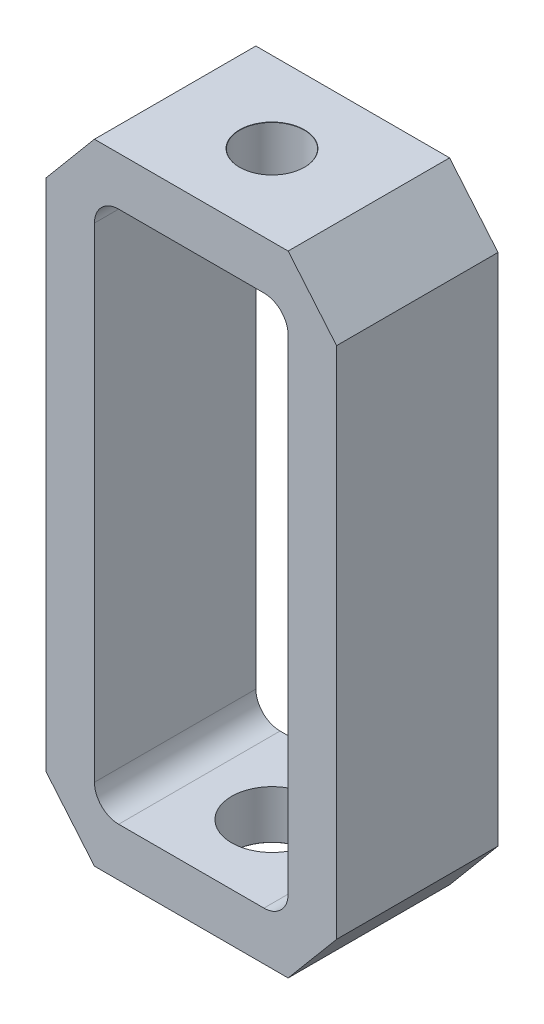
ISO-10303-21;
HEADER;
FILE_DESCRIPTION(('STEP AP214'),'2;1');
FILE_NAME('part.step','',(''),(''),'','','');
FILE_SCHEMA(('AUTOMOTIVE_DESIGN { 1 0 10303 214 1 1 1 1 }'));
ENDSEC;
DATA;
#1=APPLICATION_CONTEXT('core data for automotive mechanical design processes');
#2=APPLICATION_PROTOCOL_DEFINITION('international standard','automotive_design',2000,#1);
#3=PRODUCT_CONTEXT('',#1,'mechanical');
#4=PRODUCT('Part','Part','',(#3));
#5=PRODUCT_RELATED_PRODUCT_CATEGORY('part','',(#4));
#6=PRODUCT_DEFINITION_FORMATION('','',#4);
#7=PRODUCT_DEFINITION_CONTEXT('part definition',#1,'design');
#8=PRODUCT_DEFINITION('design','',#6,#7);
#9=PRODUCT_DEFINITION_SHAPE('','',#8);
#10=(LENGTH_UNIT() NAMED_UNIT(*) SI_UNIT(.MILLI.,.METRE.));
#11=(NAMED_UNIT(*) PLANE_ANGLE_UNIT() SI_UNIT($,.RADIAN.));
#12=(NAMED_UNIT(*) SI_UNIT($,.STERADIAN.) SOLID_ANGLE_UNIT());
#13=UNCERTAINTY_MEASURE_WITH_UNIT(LENGTH_MEASURE(1.E-05),#10,'distance_accuracy_value','');
#14=(GEOMETRIC_REPRESENTATION_CONTEXT(3) GLOBAL_UNCERTAINTY_ASSIGNED_CONTEXT((#13)) GLOBAL_UNIT_ASSIGNED_CONTEXT((#10,
#11,#12)) REPRESENTATION_CONTEXT('',''));
#15=CARTESIAN_POINT('',(0.,0.,0.));
#16=DIRECTION('',(0.,0.,1.));
#17=DIRECTION('',(1.,0.,0.));
#18=AXIS2_PLACEMENT_3D('',#15,#16,#17);
#19=CARTESIAN_POINT('',(-18.,0.,10.));
#20=DIRECTION('',(-1.,0.,0.));
#21=DIRECTION('',(0.,-1.,0.));
#22=AXIS2_PLACEMENT_3D('',#19,#20,#21);
#23=PLANE('',#22);
#24=DIRECTION('',(0.,1.,0.));
#25=VECTOR('',#24,1.);
#26=CARTESIAN_POINT('',(-18.,0.,-10.));
#27=LINE('',#26,#25);
#28=CARTESIAN_POINT('',(-18.,-31.8494784444347,-10.));
#29=VERTEX_POINT('',#28);
#30=CARTESIAN_POINT('',(-18.,31.8494784444347,-10.));
#31=VERTEX_POINT('',#30);
#32=EDGE_CURVE('E161',#29,#31,#27,.T.);
#33=ORIENTED_EDGE('',*,*,#32,.F.);
#34=DIRECTION('',(0.,0.,-1.));
#35=VECTOR('',#34,1.);
#36=CARTESIAN_POINT('',(-18.,-31.8494784444347,10.));
#37=LINE('',#36,#35);
#38=CARTESIAN_POINT('',(-18.,-31.8494784444347,10.));
#39=VERTEX_POINT('',#38);
#40=EDGE_CURVE('E155',#39,#29,#37,.T.);
#41=ORIENTED_EDGE('',*,*,#40,.F.);
#42=DIRECTION('',(0.,1.,0.));
#43=VECTOR('',#42,1.);
#44=CARTESIAN_POINT('',(-18.,0.,10.));
#45=LINE('',#44,#43);
#46=CARTESIAN_POINT('',(-18.,31.8494784444347,10.));
#47=VERTEX_POINT('',#46);
#48=EDGE_CURVE('E158',#39,#47,#45,.T.);
#49=ORIENTED_EDGE('',*,*,#48,.T.);
#50=DIRECTION('',(0.,0.,-1.));
#51=VECTOR('',#50,1.);
#52=CARTESIAN_POINT('',(-18.,31.8494784444347,10.));
#53=LINE('',#52,#51);
#54=EDGE_CURVE('E210',#47,#31,#53,.T.);
#55=ORIENTED_EDGE('',*,*,#54,.T.);
#56=EDGE_LOOP('',(#33,#41,#49,#55));
#57=FACE_BOUND('',#56,.T.);
#58=ADVANCED_FACE('F41',(#57),#23,.T.);
#59=CARTESIAN_POINT('',(-26.2456402497396,-22.0227070535682,10.));
#60=DIRECTION('',(0.766044443118977,0.642787609686541,0.));
#61=DIRECTION('',(-0.642787609686541,0.766044443118977,0.));
#62=AXIS2_PLACEMENT_3D('',#59,#60,#61);
#63=PLANE('',#62);
#64=DIRECTION('',(0.642787609686541,-0.766044443118977,0.));
#65=VECTOR('',#64,1.);
#66=CARTESIAN_POINT('',(-26.2456402497396,-22.0227070535682,-10.));
#67=LINE('',#66,#65);
#68=CARTESIAN_POINT('',(-12.,-39.,-10.));
#69=VERTEX_POINT('',#68);
#70=EDGE_CURVE('E229',#29,#69,#67,.T.);
#71=ORIENTED_EDGE('',*,*,#70,.T.);
#72=DIRECTION('',(0.,0.,-1.));
#73=VECTOR('',#72,1.);
#74=CARTESIAN_POINT('',(-12.,-39.,10.));
#75=LINE('',#74,#73);
#76=CARTESIAN_POINT('',(-12.,-39.,10.));
#77=VERTEX_POINT('',#76);
#78=EDGE_CURVE('E167',#77,#69,#75,.T.);
#79=ORIENTED_EDGE('',*,*,#78,.F.);
#80=DIRECTION('',(0.642787609686541,-0.766044443118977,0.));
#81=VECTOR('',#80,1.);
#82=CARTESIAN_POINT('',(-26.2456402497396,-22.0227070535682,10.));
#83=LINE('',#82,#81);
#84=EDGE_CURVE('E171',#39,#77,#83,.T.);
#85=ORIENTED_EDGE('',*,*,#84,.F.);
#86=ORIENTED_EDGE('',*,*,#40,.T.);
#87=EDGE_LOOP('',(#71,#79,#85,#86));
#88=FACE_BOUND('',#87,.T.);
#89=ADVANCED_FACE('F172',(#88),#63,.F.);
#90=CARTESIAN_POINT('',(0.,-39.,10.));
#91=DIRECTION('',(0.,1.,0.));
#92=DIRECTION('',(0.,0.,1.));
#93=AXIS2_PLACEMENT_3D('',#90,#91,#92);
#94=PLANE('',#93);
#95=CARTESIAN_POINT('',(0.,-39.,0.));
#96=DIRECTION('',(0.,-1.,0.));
#97=DIRECTION('',(0.,0.,-1.));
#98=AXIS2_PLACEMENT_3D('',#95,#96,#97);
#99=CIRCLE('',#98,5.025);
#100=CARTESIAN_POINT('',(0.,-39.,-5.025));
#101=VERTEX_POINT('',#100);
#102=EDGE_CURVE('E362',#101,#101,#99,.T.);
#103=ORIENTED_EDGE('',*,*,#102,.F.);
#104=EDGE_LOOP('',(#103));
#105=FACE_BOUND('',#104,.T.);
#106=DIRECTION('',(1.,0.,0.));
#107=VECTOR('',#106,1.);
#108=CARTESIAN_POINT('',(0.,-39.,-10.));
#109=LINE('',#108,#107);
#110=CARTESIAN_POINT('',(12.,-39.,-10.));
#111=VERTEX_POINT('',#110);
#112=EDGE_CURVE('E232',#69,#111,#109,.T.);
#113=ORIENTED_EDGE('',*,*,#112,.T.);
#114=DIRECTION('',(0.,0.,-1.));
#115=VECTOR('',#114,1.);
#116=CARTESIAN_POINT('',(12.,-39.,10.));
#117=LINE('',#116,#115);
#118=CARTESIAN_POINT('',(12.,-39.,10.));
#119=VERTEX_POINT('',#118);
#120=EDGE_CURVE('E272',#119,#111,#117,.T.);
#121=ORIENTED_EDGE('',*,*,#120,.F.);
#122=DIRECTION('',(1.,0.,0.));
#123=VECTOR('',#122,1.);
#124=CARTESIAN_POINT('',(0.,-39.,10.));
#125=LINE('',#124,#123);
#126=EDGE_CURVE('E176',#77,#119,#125,.T.);
#127=ORIENTED_EDGE('',*,*,#126,.F.);
#128=ORIENTED_EDGE('',*,*,#78,.T.);
#129=EDGE_LOOP('',(#113,#121,#127,#128));
#130=FACE_BOUND('',#129,.T.);
#131=ADVANCED_FACE('F369',(#105,#130),#94,.F.);
#132=CARTESIAN_POINT('',(26.2456402497396,-22.0227070535682,10.));
#133=DIRECTION('',(0.766044443118977,-0.642787609686541,0.));
#134=DIRECTION('',(0.642787609686541,0.766044443118977,0.));
#135=AXIS2_PLACEMENT_3D('',#132,#133,#134);
#136=PLANE('',#135);
#137=DIRECTION('',(-0.642787609686541,-0.766044443118977,0.));
#138=VECTOR('',#137,1.);
#139=CARTESIAN_POINT('',(26.2456402497396,-22.0227070535682,-10.));
#140=LINE('',#139,#138);
#141=CARTESIAN_POINT('',(18.,-31.8494784444347,-10.));
#142=VERTEX_POINT('',#141);
#143=EDGE_CURVE('E236',#142,#111,#140,.T.);
#144=ORIENTED_EDGE('',*,*,#143,.F.);
#145=DIRECTION('',(0.,0.,-1.));
#146=VECTOR('',#145,1.);
#147=CARTESIAN_POINT('',(18.,-31.8494784444347,10.));
#148=LINE('',#147,#146);
#149=CARTESIAN_POINT('',(18.,-31.8494784444347,10.));
#150=VERTEX_POINT('',#149);
#151=EDGE_CURVE('E269',#150,#142,#148,.T.);
#152=ORIENTED_EDGE('',*,*,#151,.F.);
#153=DIRECTION('',(-0.642787609686541,-0.766044443118977,0.));
#154=VECTOR('',#153,1.);
#155=CARTESIAN_POINT('',(26.2456402497396,-22.0227070535682,10.));
#156=LINE('',#155,#154);
#157=EDGE_CURVE('E193',#150,#119,#156,.T.);
#158=ORIENTED_EDGE('',*,*,#157,.T.);
#159=ORIENTED_EDGE('',*,*,#120,.T.);
#160=EDGE_LOOP('',(#144,#152,#158,#159));
#161=FACE_BOUND('',#160,.T.);
#162=ADVANCED_FACE('F372',(#161),#136,.T.);
#163=CARTESIAN_POINT('',(18.,0.,10.));
#164=DIRECTION('',(-1.,0.,0.));
#165=DIRECTION('',(0.,0.,1.));
#166=AXIS2_PLACEMENT_3D('',#163,#164,#165);
#167=PLANE('',#166);
#168=DIRECTION('',(0.,1.,0.));
#169=VECTOR('',#168,1.);
#170=CARTESIAN_POINT('',(18.,0.,-10.));
#171=LINE('',#170,#169);
#172=CARTESIAN_POINT('',(18.,31.8494784444347,-10.));
#173=VERTEX_POINT('',#172);
#174=EDGE_CURVE('E240',#142,#173,#171,.T.);
#175=ORIENTED_EDGE('',*,*,#174,.T.);
#176=DIRECTION('',(0.,0.,-1.));
#177=VECTOR('',#176,1.);
#178=CARTESIAN_POINT('',(18.,31.8494784444347,10.));
#179=LINE('',#178,#177);
#180=CARTESIAN_POINT('',(18.,31.8494784444347,10.));
#181=VERTEX_POINT('',#180);
#182=EDGE_CURVE('E265',#181,#173,#179,.T.);
#183=ORIENTED_EDGE('',*,*,#182,.F.);
#184=DIRECTION('',(0.,1.,0.));
#185=VECTOR('',#184,1.);
#186=CARTESIAN_POINT('',(18.,0.,10.));
#187=LINE('',#186,#185);
#188=EDGE_CURVE('E197',#150,#181,#187,.T.);
#189=ORIENTED_EDGE('',*,*,#188,.F.);
#190=ORIENTED_EDGE('',*,*,#151,.T.);
#191=EDGE_LOOP('',(#175,#183,#189,#190));
#192=FACE_BOUND('',#191,.T.);
#193=ADVANCED_FACE('F383',(#192),#167,.F.);
#194=CARTESIAN_POINT('',(26.2456402497396,22.0227070535682,10.));
#195=DIRECTION('',(-0.766044443118977,-0.642787609686541,0.));
#196=DIRECTION('',(0.642787609686541,-0.766044443118977,0.));
#197=AXIS2_PLACEMENT_3D('',#194,#195,#196);
#198=PLANE('',#197);
#199=DIRECTION('',(-0.642787609686541,0.766044443118977,0.));
#200=VECTOR('',#199,1.);
#201=CARTESIAN_POINT('',(26.2456402497396,22.0227070535682,-10.));
#202=LINE('',#201,#200);
#203=CARTESIAN_POINT('',(12.,39.,-10.));
#204=VERTEX_POINT('',#203);
#205=EDGE_CURVE('E244',#173,#204,#202,.T.);
#206=ORIENTED_EDGE('',*,*,#205,.T.);
#207=DIRECTION('',(0.,0.,-1.));
#208=VECTOR('',#207,1.);
#209=CARTESIAN_POINT('',(12.,39.,10.));
#210=LINE('',#209,#208);
#211=CARTESIAN_POINT('',(12.,39.,10.));
#212=VERTEX_POINT('',#211);
#213=EDGE_CURVE('E262',#212,#204,#210,.T.);
#214=ORIENTED_EDGE('',*,*,#213,.F.);
#215=DIRECTION('',(-0.642787609686541,0.766044443118977,0.));
#216=VECTOR('',#215,1.);
#217=CARTESIAN_POINT('',(26.2456402497396,22.0227070535682,10.));
#218=LINE('',#217,#216);
#219=EDGE_CURVE('E201',#181,#212,#218,.T.);
#220=ORIENTED_EDGE('',*,*,#219,.F.);
#221=ORIENTED_EDGE('',*,*,#182,.T.);
#222=EDGE_LOOP('',(#206,#214,#220,#221));
#223=FACE_BOUND('',#222,.T.);
#224=ADVANCED_FACE('F385',(#223),#198,.F.);
#225=CARTESIAN_POINT('',(0.,39.,10.));
#226=DIRECTION('',(0.,1.,0.));
#227=DIRECTION('',(0.,0.,1.));
#228=AXIS2_PLACEMENT_3D('',#225,#226,#227);
#229=PLANE('',#228);
#230=CARTESIAN_POINT('',(0.,39.,0.));
#231=DIRECTION('',(0.,1.,0.));
#232=DIRECTION('',(0.,0.,1.));
#233=AXIS2_PLACEMENT_3D('',#230,#231,#232);
#234=CIRCLE('',#233,4.025);
#235=CARTESIAN_POINT('',(0.,39.,4.025));
#236=VERTEX_POINT('',#235);
#237=EDGE_CURVE('E285',#236,#236,#234,.T.);
#238=ORIENTED_EDGE('',*,*,#237,.F.);
#239=EDGE_LOOP('',(#238));
#240=FACE_BOUND('',#239,.T.);
#241=DIRECTION('',(1.,0.,0.));
#242=VECTOR('',#241,1.);
#243=CARTESIAN_POINT('',(0.,39.,-10.));
#244=LINE('',#243,#242);
#245=CARTESIAN_POINT('',(-12.,39.,-10.));
#246=VERTEX_POINT('',#245);
#247=EDGE_CURVE('E248',#246,#204,#244,.T.);
#248=ORIENTED_EDGE('',*,*,#247,.F.);
#249=DIRECTION('',(0.,0.,-1.));
#250=VECTOR('',#249,1.);
#251=CARTESIAN_POINT('',(-12.,39.,10.));
#252=LINE('',#251,#250);
#253=CARTESIAN_POINT('',(-12.,39.,10.));
#254=VERTEX_POINT('',#253);
#255=EDGE_CURVE('E259',#254,#246,#252,.T.);
#256=ORIENTED_EDGE('',*,*,#255,.F.);
#257=DIRECTION('',(1.,0.,0.));
#258=VECTOR('',#257,1.);
#259=CARTESIAN_POINT('',(0.,39.,10.));
#260=LINE('',#259,#258);
#261=EDGE_CURVE('E204',#254,#212,#260,.T.);
#262=ORIENTED_EDGE('',*,*,#261,.T.);
#263=ORIENTED_EDGE('',*,*,#213,.T.);
#264=EDGE_LOOP('',(#248,#256,#262,#263));
#265=FACE_BOUND('',#264,.T.);
#266=ADVANCED_FACE('F388',(#240,#265),#229,.T.);
#267=CARTESIAN_POINT('',(0.,-33.,10.));
#268=DIRECTION('',(0.,1.,0.));
#269=DIRECTION('',(0.,0.,1.));
#270=AXIS2_PLACEMENT_3D('',#267,#268,#269);
#271=PLANE('',#270);
#272=CARTESIAN_POINT('',(0.,-33.,0.));
#273=DIRECTION('',(0.,1.,0.));
#274=DIRECTION('',(0.,0.,1.));
#275=AXIS2_PLACEMENT_3D('',#272,#273,#274);
#276=CIRCLE('',#275,4.99999999999999);
#277=CARTESIAN_POINT('',(0.,-33.,4.99999999999999));
#278=VERTEX_POINT('',#277);
#279=EDGE_CURVE('E281',#278,#278,#276,.T.);
#280=ORIENTED_EDGE('',*,*,#279,.F.);
#281=EDGE_LOOP('',(#280));
#282=FACE_BOUND('',#281,.T.);
#283=DIRECTION('',(1.,0.,0.));
#284=VECTOR('',#283,1.);
#285=CARTESIAN_POINT('',(0.,-33.,10.));
#286=LINE('',#285,#284);
#287=CARTESIAN_POINT('',(-8.99999999999999,-33.,10.));
#288=VERTEX_POINT('',#287);
#289=CARTESIAN_POINT('',(9.00000000000001,-33.,10.));
#290=VERTEX_POINT('',#289);
#291=EDGE_CURVE('E256',#288,#290,#286,.T.);
#292=ORIENTED_EDGE('',*,*,#291,.T.);
#293=DIRECTION('',(0.,0.,-1.));
#294=VECTOR('',#293,1.);
#295=CARTESIAN_POINT('',(9.00000000000001,-33.,-10.));
#296=LINE('',#295,#294);
#297=CARTESIAN_POINT('',(9.00000000000001,-33.,-10.));
#298=VERTEX_POINT('',#297);
#299=EDGE_CURVE('E289',#290,#298,#296,.T.);
#300=ORIENTED_EDGE('',*,*,#299,.T.);
#301=DIRECTION('',(1.,0.,0.));
#302=VECTOR('',#301,1.);
#303=CARTESIAN_POINT('',(0.,-33.,-10.));
#304=LINE('',#303,#302);
#305=CARTESIAN_POINT('',(-8.99999999999999,-33.,-10.));
#306=VERTEX_POINT('',#305);
#307=EDGE_CURVE('E211',#306,#298,#304,.T.);
#308=ORIENTED_EDGE('',*,*,#307,.F.);
#309=DIRECTION('',(0.,0.,-1.));
#310=VECTOR('',#309,1.);
#311=CARTESIAN_POINT('',(-8.99999999999999,-33.,10.));
#312=LINE('',#311,#310);
#313=EDGE_CURVE('E166',#306,#288,#312,.F.);
#314=ORIENTED_EDGE('',*,*,#313,.T.);
#315=EDGE_LOOP('',(#292,#300,#308,#314));
#316=FACE_BOUND('',#315,.T.);
#317=ADVANCED_FACE('F416',(#282,#316),#271,.T.);
#318=CARTESIAN_POINT('',(-12.,0.,10.));
#319=DIRECTION('',(-1.,0.,0.));
#320=DIRECTION('',(0.,-1.,0.));
#321=AXIS2_PLACEMENT_3D('',#318,#319,#320);
#322=PLANE('',#321);
#323=DIRECTION('',(0.,1.,0.));
#324=VECTOR('',#323,1.);
#325=CARTESIAN_POINT('',(-12.,0.,10.));
#326=LINE('',#325,#324);
#327=CARTESIAN_POINT('',(-12.,-30.,10.));
#328=VERTEX_POINT('',#327);
#329=CARTESIAN_POINT('',(-12.,30.,10.));
#330=VERTEX_POINT('',#329);
#331=EDGE_CURVE('E346',#328,#330,#326,.T.);
#332=ORIENTED_EDGE('',*,*,#331,.F.);
#333=DIRECTION('',(0.,0.,-1.));
#334=VECTOR('',#333,1.);
#335=CARTESIAN_POINT('',(-12.,-30.,10.));
#336=LINE('',#335,#334);
#337=CARTESIAN_POINT('',(-12.,-30.,-10.));
#338=VERTEX_POINT('',#337);
#339=EDGE_CURVE('E303',#328,#338,#336,.T.);
#340=ORIENTED_EDGE('',*,*,#339,.T.);
#341=DIRECTION('',(0.,1.,0.));
#342=VECTOR('',#341,1.);
#343=CARTESIAN_POINT('',(-12.,0.,-10.));
#344=LINE('',#343,#342);
#345=CARTESIAN_POINT('',(-12.,30.,-10.));
#346=VERTEX_POINT('',#345);
#347=EDGE_CURVE('E215',#338,#346,#344,.T.);
#348=ORIENTED_EDGE('',*,*,#347,.T.);
#349=DIRECTION('',(0.,0.,-1.));
#350=VECTOR('',#349,1.);
#351=CARTESIAN_POINT('',(-12.,30.,10.));
#352=LINE('',#351,#350);
#353=EDGE_CURVE('E300',#346,#330,#352,.F.);
#354=ORIENTED_EDGE('',*,*,#353,.T.);
#355=EDGE_LOOP('',(#332,#340,#348,#354));
#356=FACE_BOUND('',#355,.T.);
#357=ADVANCED_FACE('F341',(#356),#322,.F.);
#358=CARTESIAN_POINT('',(0.,33.,10.));
#359=DIRECTION('',(0.,1.,0.));
#360=DIRECTION('',(0.,0.,1.));
#361=AXIS2_PLACEMENT_3D('',#358,#359,#360);
#362=PLANE('',#361);
#363=CARTESIAN_POINT('',(0.,33.,0.));
#364=DIRECTION('',(0.,1.,0.));
#365=DIRECTION('',(0.,0.,1.));
#366=AXIS2_PLACEMENT_3D('',#363,#364,#365);
#367=CIRCLE('',#366,4.);
#368=CARTESIAN_POINT('',(0.,33.,4.));
#369=VERTEX_POINT('',#368);
#370=EDGE_CURVE('E216',#369,#369,#367,.T.);
#371=ORIENTED_EDGE('',*,*,#370,.T.);
#372=EDGE_LOOP('',(#371));
#373=FACE_BOUND('',#372,.T.);
#374=DIRECTION('',(1.,0.,0.));
#375=VECTOR('',#374,1.);
#376=CARTESIAN_POINT('',(0.,33.,-10.));
#377=LINE('',#376,#375);
#378=CARTESIAN_POINT('',(-9.00000000000001,33.,-10.));
#379=VERTEX_POINT('',#378);
#380=CARTESIAN_POINT('',(9.00000000000001,33.,-10.));
#381=VERTEX_POINT('',#380);
#382=EDGE_CURVE('E220',#379,#381,#377,.T.);
#383=ORIENTED_EDGE('',*,*,#382,.T.);
#384=DIRECTION('',(0.,0.,-1.));
#385=VECTOR('',#384,1.);
#386=CARTESIAN_POINT('',(9.00000000000001,33.,10.));
#387=LINE('',#386,#385);
#388=CARTESIAN_POINT('',(9.00000000000001,33.,10.));
#389=VERTEX_POINT('',#388);
#390=EDGE_CURVE('E57',#381,#389,#387,.F.);
#391=ORIENTED_EDGE('',*,*,#390,.T.);
#392=DIRECTION('',(1.,0.,0.));
#393=VECTOR('',#392,1.);
#394=CARTESIAN_POINT('',(0.,33.,10.));
#395=LINE('',#394,#393);
#396=CARTESIAN_POINT('',(-9.00000000000001,33.,10.));
#397=VERTEX_POINT('',#396);
#398=EDGE_CURVE('E187',#397,#389,#395,.T.);
#399=ORIENTED_EDGE('',*,*,#398,.F.);
#400=DIRECTION('',(0.,0.,-1.));
#401=VECTOR('',#400,1.);
#402=CARTESIAN_POINT('',(-9.00000000000001,33.,-10.));
#403=LINE('',#402,#401);
#404=EDGE_CURVE('E307',#397,#379,#403,.T.);
#405=ORIENTED_EDGE('',*,*,#404,.T.);
#406=EDGE_LOOP('',(#383,#391,#399,#405));
#407=FACE_BOUND('',#406,.T.);
#408=ADVANCED_FACE('F343',(#373,#407),#362,.F.);
#409=CARTESIAN_POINT('',(12.,0.,10.));
#410=DIRECTION('',(-1.,0.,0.));
#411=DIRECTION('',(0.,0.,1.));
#412=AXIS2_PLACEMENT_3D('',#409,#410,#411);
#413=PLANE('',#412);
#414=DIRECTION('',(0.,1.,0.));
#415=VECTOR('',#414,1.);
#416=CARTESIAN_POINT('',(12.,0.,-10.));
#417=LINE('',#416,#415);
#418=CARTESIAN_POINT('',(12.,-30.,-10.));
#419=VERTEX_POINT('',#418);
#420=CARTESIAN_POINT('',(12.,30.,-10.));
#421=VERTEX_POINT('',#420);
#422=EDGE_CURVE('E223',#419,#421,#417,.T.);
#423=ORIENTED_EDGE('',*,*,#422,.F.);
#424=DIRECTION('',(0.,0.,-1.));
#425=VECTOR('',#424,1.);
#426=CARTESIAN_POINT('',(12.,-30.,10.));
#427=LINE('',#426,#425);
#428=CARTESIAN_POINT('',(12.,-30.,10.));
#429=VERTEX_POINT('',#428);
#430=EDGE_CURVE('E297',#419,#429,#427,.F.);
#431=ORIENTED_EDGE('',*,*,#430,.T.);
#432=DIRECTION('',(0.,1.,0.));
#433=VECTOR('',#432,1.);
#434=CARTESIAN_POINT('',(12.,0.,10.));
#435=LINE('',#434,#433);
#436=CARTESIAN_POINT('',(12.,30.,10.));
#437=VERTEX_POINT('',#436);
#438=EDGE_CURVE('E183',#429,#437,#435,.T.);
#439=ORIENTED_EDGE('',*,*,#438,.T.);
#440=DIRECTION('',(0.,0.,-1.));
#441=VECTOR('',#440,1.);
#442=CARTESIAN_POINT('',(12.,30.,10.));
#443=LINE('',#442,#441);
#444=EDGE_CURVE('E293',#437,#421,#443,.T.);
#445=ORIENTED_EDGE('',*,*,#444,.T.);
#446=EDGE_LOOP('',(#423,#431,#439,#445));
#447=FACE_BOUND('',#446,.T.);
#448=ADVANCED_FACE('F393',(#447),#413,.T.);
#449=CARTESIAN_POINT('',(-26.2456402497396,22.0227070535681,10.));
#450=DIRECTION('',(-0.766044443118977,0.64278760968654,0.));
#451=DIRECTION('',(-0.64278760968654,-0.766044443118977,0.));
#452=AXIS2_PLACEMENT_3D('',#449,#450,#451);
#453=PLANE('',#452);
#454=DIRECTION('',(0.64278760968654,0.766044443118977,0.));
#455=VECTOR('',#454,1.);
#456=CARTESIAN_POINT('',(-26.2456402497396,22.0227070535681,-10.));
#457=LINE('',#456,#455);
#458=EDGE_CURVE('E252',#31,#246,#457,.T.);
#459=ORIENTED_EDGE('',*,*,#458,.F.);
#460=ORIENTED_EDGE('',*,*,#54,.F.);
#461=DIRECTION('',(0.64278760968654,0.766044443118977,0.));
#462=VECTOR('',#461,1.);
#463=CARTESIAN_POINT('',(-26.2456402497396,22.0227070535681,10.));
#464=LINE('',#463,#462);
#465=EDGE_CURVE('E181',#47,#254,#464,.T.);
#466=ORIENTED_EDGE('',*,*,#465,.T.);
#467=ORIENTED_EDGE('',*,*,#255,.T.);
#468=EDGE_LOOP('',(#459,#460,#466,#467));
#469=FACE_BOUND('',#468,.T.);
#470=ADVANCED_FACE('F391',(#469),#453,.T.);
#471=CARTESIAN_POINT('',(0.,0.,10.));
#472=DIRECTION('',(0.,0.,1.));
#473=DIRECTION('',(1.,0.,0.));
#474=AXIS2_PLACEMENT_3D('',#471,#472,#473);
#475=PLANE('',#474);
#476=ORIENTED_EDGE('',*,*,#291,.F.);
#477=CARTESIAN_POINT('',(-8.99999999999999,-30.,10.));
#478=DIRECTION('',(0.,0.,1.));
#479=DIRECTION('',(1.,0.,0.));
#480=AXIS2_PLACEMENT_3D('',#477,#478,#479);
#481=CIRCLE('',#480,3.);
#482=EDGE_CURVE('E322',#288,#328,#481,.F.);
#483=ORIENTED_EDGE('',*,*,#482,.T.);
#484=ORIENTED_EDGE('',*,*,#331,.T.);
#485=CARTESIAN_POINT('',(-9.00000000000001,30.,10.));
#486=DIRECTION('',(0.,0.,1.));
#487=DIRECTION('',(1.,0.,0.));
#488=AXIS2_PLACEMENT_3D('',#485,#486,#487);
#489=CIRCLE('',#488,3.);
#490=EDGE_CURVE('E11',#330,#397,#489,.F.);
#491=ORIENTED_EDGE('',*,*,#490,.T.);
#492=ORIENTED_EDGE('',*,*,#398,.T.);
#493=CARTESIAN_POINT('',(9.00000000000001,30.,10.));
#494=DIRECTION('',(0.,0.,1.));
#495=DIRECTION('',(1.,0.,0.));
#496=AXIS2_PLACEMENT_3D('',#493,#494,#495);
#497=CIRCLE('',#496,3.);
#498=EDGE_CURVE('E328',#389,#437,#497,.F.);
#499=ORIENTED_EDGE('',*,*,#498,.T.);
#500=ORIENTED_EDGE('',*,*,#438,.F.);
#501=CARTESIAN_POINT('',(9.00000000000001,-30.,10.));
#502=DIRECTION('',(0.,0.,1.));
#503=DIRECTION('',(1.,0.,0.));
#504=AXIS2_PLACEMENT_3D('',#501,#502,#503);
#505=CIRCLE('',#504,3.);
#506=EDGE_CURVE('E316',#429,#290,#505,.F.);
#507=ORIENTED_EDGE('',*,*,#506,.T.);
#508=EDGE_LOOP('',(#476,#483,#484,#491,#492,#499,#500,#507));
#509=FACE_BOUND('',#508,.T.);
#510=ORIENTED_EDGE('',*,*,#48,.F.);
#511=ORIENTED_EDGE('',*,*,#84,.T.);
#512=ORIENTED_EDGE('',*,*,#126,.T.);
#513=ORIENTED_EDGE('',*,*,#157,.F.);
#514=ORIENTED_EDGE('',*,*,#188,.T.);
#515=ORIENTED_EDGE('',*,*,#219,.T.);
#516=ORIENTED_EDGE('',*,*,#261,.F.);
#517=ORIENTED_EDGE('',*,*,#465,.F.);
#518=EDGE_LOOP('',(#510,#511,#512,#513,#514,#515,#516,#517));
#519=FACE_BOUND('',#518,.T.);
#520=ADVANCED_FACE('F178',(#509,#519),#475,.T.);
#521=CARTESIAN_POINT('',(0.,0.,-10.));
#522=DIRECTION('',(0.,0.,1.));
#523=DIRECTION('',(1.,0.,0.));
#524=AXIS2_PLACEMENT_3D('',#521,#522,#523);
#525=PLANE('',#524);
#526=ORIENTED_EDGE('',*,*,#347,.F.);
#527=CARTESIAN_POINT('',(-8.99999999999999,-30.,-10.));
#528=DIRECTION('',(0.,0.,1.));
#529=DIRECTION('',(1.,0.,0.));
#530=AXIS2_PLACEMENT_3D('',#527,#528,#529);
#531=CIRCLE('',#530,3.);
#532=EDGE_CURVE('E319',#338,#306,#531,.T.);
#533=ORIENTED_EDGE('',*,*,#532,.T.);
#534=ORIENTED_EDGE('',*,*,#307,.T.);
#535=CARTESIAN_POINT('',(9.00000000000001,-30.,-10.));
#536=DIRECTION('',(0.,0.,1.));
#537=DIRECTION('',(1.,0.,0.));
#538=AXIS2_PLACEMENT_3D('',#535,#536,#537);
#539=CIRCLE('',#538,3.);
#540=EDGE_CURVE('E313',#298,#419,#539,.T.);
#541=ORIENTED_EDGE('',*,*,#540,.T.);
#542=ORIENTED_EDGE('',*,*,#422,.T.);
#543=CARTESIAN_POINT('',(9.00000000000001,30.,-10.));
#544=DIRECTION('',(0.,0.,1.));
#545=DIRECTION('',(1.,0.,0.));
#546=AXIS2_PLACEMENT_3D('',#543,#544,#545);
#547=CIRCLE('',#546,3.);
#548=EDGE_CURVE('E325',#421,#381,#547,.T.);
#549=ORIENTED_EDGE('',*,*,#548,.T.);
#550=ORIENTED_EDGE('',*,*,#382,.F.);
#551=CARTESIAN_POINT('',(-9.00000000000001,30.,-10.));
#552=DIRECTION('',(0.,0.,1.));
#553=DIRECTION('',(1.,0.,0.));
#554=AXIS2_PLACEMENT_3D('',#551,#552,#553);
#555=CIRCLE('',#554,3.);
#556=EDGE_CURVE('E50',#379,#346,#555,.T.);
#557=ORIENTED_EDGE('',*,*,#556,.T.);
#558=EDGE_LOOP('',(#526,#533,#534,#541,#542,#549,#550,#557));
#559=FACE_BOUND('',#558,.T.);
#560=ORIENTED_EDGE('',*,*,#32,.T.);
#561=ORIENTED_EDGE('',*,*,#458,.T.);
#562=ORIENTED_EDGE('',*,*,#247,.T.);
#563=ORIENTED_EDGE('',*,*,#205,.F.);
#564=ORIENTED_EDGE('',*,*,#174,.F.);
#565=ORIENTED_EDGE('',*,*,#143,.T.);
#566=ORIENTED_EDGE('',*,*,#112,.F.);
#567=ORIENTED_EDGE('',*,*,#70,.F.);
#568=EDGE_LOOP('',(#560,#561,#562,#563,#564,#565,#566,#567));
#569=FACE_BOUND('',#568,.T.);
#570=ADVANCED_FACE('F334',(#559,#569),#525,.F.);
#571=CARTESIAN_POINT('',(0.,39.,0.));
#572=DIRECTION('',(0.,1.,0.));
#573=DIRECTION('',(0.,0.,1.));
#574=AXIS2_PLACEMENT_3D('',#571,#572,#573);
#575=CYLINDRICAL_SURFACE('',#574,4.);
#576=CARTESIAN_POINT('',(0.,38.975,0.));
#577=DIRECTION('',(0.,1.,0.));
#578=DIRECTION('',(0.,0.,1.));
#579=AXIS2_PLACEMENT_3D('',#576,#577,#578);
#580=CIRCLE('',#579,4.);
#581=CARTESIAN_POINT('',(0.,38.975,4.));
#582=VERTEX_POINT('',#581);
#583=EDGE_CURVE('E280',#582,#582,#580,.T.);
#584=ORIENTED_EDGE('',*,*,#583,.T.);
#585=EDGE_LOOP('',(#584));
#586=FACE_BOUND('',#585,.T.);
#587=ORIENTED_EDGE('',*,*,#370,.F.);
#588=EDGE_LOOP('',(#587));
#589=FACE_BOUND('',#588,.T.);
#590=ADVANCED_FACE('F473',(#586,#589),#575,.F.);
#591=CARTESIAN_POINT('',(0.,39.,0.));
#592=DIRECTION('',(0.,1.,0.));
#593=DIRECTION('',(0.,0.,1.));
#594=AXIS2_PLACEMENT_3D('',#591,#592,#593);
#595=CONICAL_SURFACE('',#594,4.025,0.785398163397431);
#596=ORIENTED_EDGE('',*,*,#583,.F.);
#597=EDGE_LOOP('',(#596));
#598=FACE_BOUND('',#597,.T.);
#599=ORIENTED_EDGE('',*,*,#237,.T.);
#600=EDGE_LOOP('',(#599));
#601=FACE_BOUND('',#600,.T.);
#602=ADVANCED_FACE('F524',(#598,#601),#595,.F.);
#603=CARTESIAN_POINT('',(0.,-39.,0.));
#604=DIRECTION('',(0.,-1.,0.));
#605=DIRECTION('',(0.,0.,-1.));
#606=AXIS2_PLACEMENT_3D('',#603,#604,#605);
#607=CYLINDRICAL_SURFACE('',#606,4.99999999999999);
#608=ORIENTED_EDGE('',*,*,#279,.T.);
#609=EDGE_LOOP('',(#608));
#610=FACE_BOUND('',#609,.T.);
#611=CARTESIAN_POINT('',(0.,-38.975,0.));
#612=DIRECTION('',(0.,-1.,0.));
#613=DIRECTION('',(0.,0.,-1.));
#614=AXIS2_PLACEMENT_3D('',#611,#612,#613);
#615=CIRCLE('',#614,4.99999999999999);
#616=CARTESIAN_POINT('',(0.,-38.975,-4.99999999999999));
#617=VERTEX_POINT('',#616);
#618=EDGE_CURVE('E286',#617,#617,#615,.T.);
#619=ORIENTED_EDGE('',*,*,#618,.T.);
#620=EDGE_LOOP('',(#619));
#621=FACE_BOUND('',#620,.T.);
#622=ADVANCED_FACE('F514',(#610,#621),#607,.F.);
#623=CARTESIAN_POINT('',(0.,-39.,0.));
#624=DIRECTION('',(0.,-1.,0.));
#625=DIRECTION('',(0.,0.,-1.));
#626=AXIS2_PLACEMENT_3D('',#623,#624,#625);
#627=CONICAL_SURFACE('',#626,5.025,0.7853981633975);
#628=ORIENTED_EDGE('',*,*,#618,.F.);
#629=EDGE_LOOP('',(#628));
#630=FACE_BOUND('',#629,.T.);
#631=ORIENTED_EDGE('',*,*,#102,.T.);
#632=EDGE_LOOP('',(#631));
#633=FACE_BOUND('',#632,.T.);
#634=ADVANCED_FACE('F367',(#630,#633),#627,.F.);
#635=CARTESIAN_POINT('',(9.00000000000001,-30.,10.));
#636=DIRECTION('',(0.,0.,1.));
#637=DIRECTION('',(1.,0.,0.));
#638=AXIS2_PLACEMENT_3D('',#635,#636,#637);
#639=CYLINDRICAL_SURFACE('',#638,3.);
#640=ORIENTED_EDGE('',*,*,#506,.F.);
#641=ORIENTED_EDGE('',*,*,#430,.F.);
#642=ORIENTED_EDGE('',*,*,#540,.F.);
#643=ORIENTED_EDGE('',*,*,#299,.F.);
#644=EDGE_LOOP('',(#640,#641,#642,#643));
#645=FACE_BOUND('',#644,.T.);
#646=ADVANCED_FACE('F420',(#645),#639,.F.);
#647=CARTESIAN_POINT('',(-8.99999999999999,-30.,10.));
#648=DIRECTION('',(0.,0.,-1.));
#649=DIRECTION('',(-1.,0.,0.));
#650=AXIS2_PLACEMENT_3D('',#647,#648,#649);
#651=CYLINDRICAL_SURFACE('',#650,3.);
#652=ORIENTED_EDGE('',*,*,#482,.F.);
#653=ORIENTED_EDGE('',*,*,#313,.F.);
#654=ORIENTED_EDGE('',*,*,#532,.F.);
#655=ORIENTED_EDGE('',*,*,#339,.F.);
#656=EDGE_LOOP('',(#652,#653,#654,#655));
#657=FACE_BOUND('',#656,.T.);
#658=ADVANCED_FACE('F423',(#657),#651,.F.);
#659=CARTESIAN_POINT('',(9.00000000000001,30.,10.));
#660=DIRECTION('',(0.,0.,-1.));
#661=DIRECTION('',(-1.,0.,0.));
#662=AXIS2_PLACEMENT_3D('',#659,#660,#661);
#663=CYLINDRICAL_SURFACE('',#662,3.);
#664=ORIENTED_EDGE('',*,*,#498,.F.);
#665=ORIENTED_EDGE('',*,*,#390,.F.);
#666=ORIENTED_EDGE('',*,*,#548,.F.);
#667=ORIENTED_EDGE('',*,*,#444,.F.);
#668=EDGE_LOOP('',(#664,#665,#666,#667));
#669=FACE_BOUND('',#668,.T.);
#670=ADVANCED_FACE('F426',(#669),#663,.F.);
#671=CARTESIAN_POINT('',(-9.00000000000001,30.,10.));
#672=DIRECTION('',(0.,0.,1.));
#673=DIRECTION('',(1.,0.,0.));
#674=AXIS2_PLACEMENT_3D('',#671,#672,#673);
#675=CYLINDRICAL_SURFACE('',#674,3.);
#676=ORIENTED_EDGE('',*,*,#490,.F.);
#677=ORIENTED_EDGE('',*,*,#353,.F.);
#678=ORIENTED_EDGE('',*,*,#556,.F.);
#679=ORIENTED_EDGE('',*,*,#404,.F.);
#680=EDGE_LOOP('',(#676,#677,#678,#679));
#681=FACE_BOUND('',#680,.T.);
#682=ADVANCED_FACE('F43',(#681),#675,.F.);
#683=CLOSED_SHELL('',(#58,#89,#131,#162,#193,#224,#266,#317,#357,#408,#448,#470,#520,#570,#590,
#602,#622,#634,#646,#658,#670,#682));
#684=MANIFOLD_SOLID_BREP('B2',#683);
#685=ADVANCED_BREP_SHAPE_REPRESENTATION('',(#18,#684),#14);
#686=SHAPE_DEFINITION_REPRESENTATION(#9,#685);
ENDSEC;
END-ISO-10303-21;
